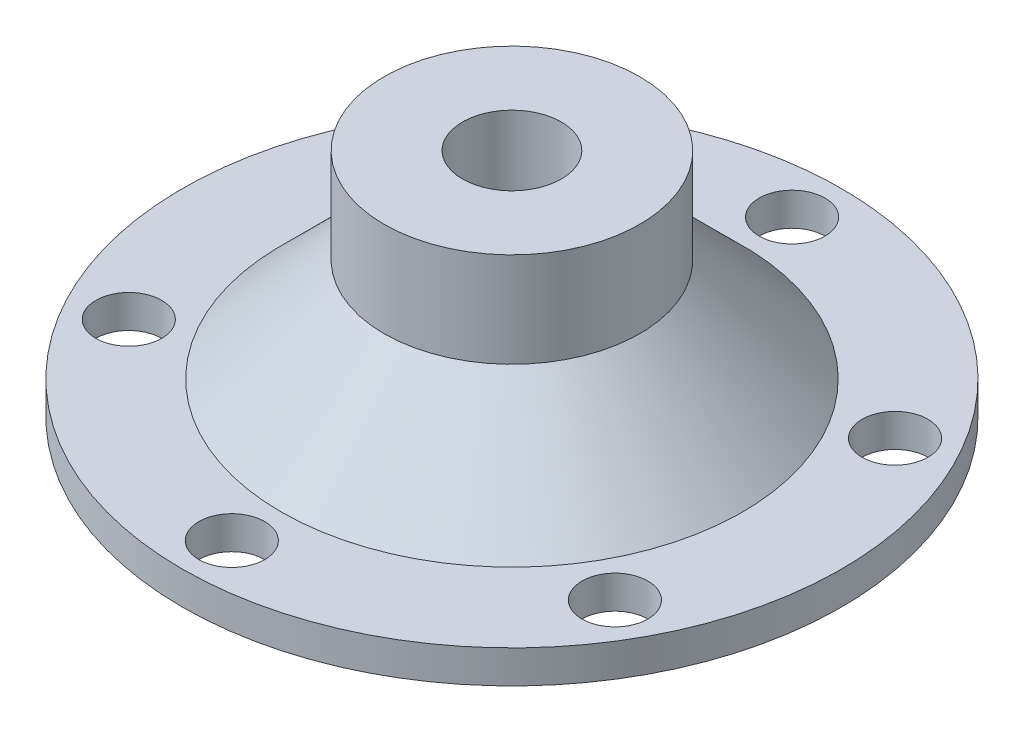
ISO-10303-21;
HEADER;
FILE_DESCRIPTION(('STEP AP214'),'2;1');
FILE_NAME('part.step','',(''),(''),'','','');
FILE_SCHEMA(('AUTOMOTIVE_DESIGN { 1 0 10303 214 1 1 1 1 }'));
ENDSEC;
DATA;
#1=APPLICATION_CONTEXT('core data for automotive mechanical design processes');
#2=APPLICATION_PROTOCOL_DEFINITION('international standard','automotive_design',2000,#1);
#3=PRODUCT_CONTEXT('',#1,'mechanical');
#4=PRODUCT('Part','Part','',(#3));
#5=PRODUCT_RELATED_PRODUCT_CATEGORY('part','',(#4));
#6=PRODUCT_DEFINITION_FORMATION('','',#4);
#7=PRODUCT_DEFINITION_CONTEXT('part definition',#1,'design');
#8=PRODUCT_DEFINITION('design','',#6,#7);
#9=PRODUCT_DEFINITION_SHAPE('','',#8);
#10=(LENGTH_UNIT() NAMED_UNIT(*) SI_UNIT(.MILLI.,.METRE.));
#11=(NAMED_UNIT(*) PLANE_ANGLE_UNIT() SI_UNIT($,.RADIAN.));
#12=(NAMED_UNIT(*) SI_UNIT($,.STERADIAN.) SOLID_ANGLE_UNIT());
#13=UNCERTAINTY_MEASURE_WITH_UNIT(LENGTH_MEASURE(1.E-05),#10,'distance_accuracy_value','');
#14=(GEOMETRIC_REPRESENTATION_CONTEXT(3) GLOBAL_UNCERTAINTY_ASSIGNED_CONTEXT((#13)) GLOBAL_UNIT_ASSIGNED_CONTEXT((#10,
#11,#12)) REPRESENTATION_CONTEXT('',''));
#15=CARTESIAN_POINT('',(0.,0.,0.));
#16=DIRECTION('',(0.,0.,1.));
#17=DIRECTION('',(1.,0.,0.));
#18=AXIS2_PLACEMENT_3D('',#15,#16,#17);
#19=CARTESIAN_POINT('',(0.,12.7,0.));
#20=DIRECTION('',(0.,-1.,0.));
#21=DIRECTION('',(0.,0.,-1.));
#22=AXIS2_PLACEMENT_3D('',#19,#20,#21);
#23=CYLINDRICAL_SURFACE('',#22,127.);
#24=CARTESIAN_POINT('',(0.,12.7,0.));
#25=DIRECTION('',(0.,1.,0.));
#26=DIRECTION('',(0.,0.,1.));
#27=AXIS2_PLACEMENT_3D('',#24,#25,#26);
#28=CIRCLE('',#27,127.);
#29=CARTESIAN_POINT('',(0.,12.7,127.));
#30=VERTEX_POINT('',#29);
#31=EDGE_CURVE('E38',#30,#30,#28,.T.);
#32=ORIENTED_EDGE('',*,*,#31,.F.);
#33=EDGE_LOOP('',(#32));
#34=FACE_BOUND('',#33,.T.);
#35=CARTESIAN_POINT('',(0.,0.,0.));
#36=DIRECTION('',(0.,1.,0.));
#37=DIRECTION('',(0.,0.,1.));
#38=AXIS2_PLACEMENT_3D('',#35,#36,#37);
#39=CIRCLE('',#38,127.);
#40=CARTESIAN_POINT('',(0.,0.,127.));
#41=VERTEX_POINT('',#40);
#42=EDGE_CURVE('E42',#41,#41,#39,.T.);
#43=ORIENTED_EDGE('',*,*,#42,.T.);
#44=EDGE_LOOP('',(#43));
#45=FACE_BOUND('',#44,.T.);
#46=ADVANCED_FACE('F31',(#34,#45),#23,.T.);
#47=CARTESIAN_POINT('',(0.,12.7,0.));
#48=DIRECTION('',(0.,1.,0.));
#49=DIRECTION('',(0.,0.,1.));
#50=AXIS2_PLACEMENT_3D('',#47,#48,#49);
#51=PLANE('',#50);
#52=CARTESIAN_POINT('',(0.,12.7,0.));
#53=DIRECTION('',(0.,1.,0.));
#54=DIRECTION('',(0.,0.,1.));
#55=AXIS2_PLACEMENT_3D('',#52,#53,#54);
#56=CIRCLE('',#55,88.9);
#57=CARTESIAN_POINT('',(0.,12.7,88.9));
#58=VERTEX_POINT('',#57);
#59=EDGE_CURVE('E78',#58,#58,#56,.T.);
#60=ORIENTED_EDGE('',*,*,#59,.F.);
#61=EDGE_LOOP('',(#60));
#62=FACE_BOUND('',#61,.T.);
#63=CARTESIAN_POINT('',(0.,12.7,-107.95));
#64=DIRECTION('',(0.,1.,0.));
#65=DIRECTION('',(0.,0.,1.));
#66=AXIS2_PLACEMENT_3D('',#63,#64,#65);
#67=CIRCLE('',#66,12.7);
#68=CARTESIAN_POINT('',(0.,12.7,-95.25));
#69=VERTEX_POINT('',#68);
#70=EDGE_CURVE('E74',#69,#69,#67,.T.);
#71=ORIENTED_EDGE('',*,*,#70,.F.);
#72=EDGE_LOOP('',(#71));
#73=FACE_BOUND('',#72,.T.);
#74=CARTESIAN_POINT('',(93.6625,12.7,53.975));
#75=DIRECTION('',(0.,1.,0.));
#76=DIRECTION('',(0.,0.,1.));
#77=AXIS2_PLACEMENT_3D('',#74,#75,#76);
#78=CIRCLE('',#77,12.7);
#79=CARTESIAN_POINT('',(93.6625,12.7,66.675));
#80=VERTEX_POINT('',#79);
#81=EDGE_CURVE('E75',#80,#80,#78,.T.);
#82=ORIENTED_EDGE('',*,*,#81,.F.);
#83=EDGE_LOOP('',(#82));
#84=FACE_BOUND('',#83,.T.);
#85=CARTESIAN_POINT('',(93.6625,12.7,-53.975));
#86=DIRECTION('',(0.,1.,0.));
#87=DIRECTION('',(0.,0.,1.));
#88=AXIS2_PLACEMENT_3D('',#85,#86,#87);
#89=CIRCLE('',#88,12.7);
#90=CARTESIAN_POINT('',(93.6625,12.7,-41.275));
#91=VERTEX_POINT('',#90);
#92=EDGE_CURVE('E49',#91,#91,#89,.T.);
#93=ORIENTED_EDGE('',*,*,#92,.F.);
#94=EDGE_LOOP('',(#93));
#95=FACE_BOUND('',#94,.T.);
#96=CARTESIAN_POINT('',(-93.6625,12.7,-53.975));
#97=DIRECTION('',(0.,1.,0.));
#98=DIRECTION('',(0.,0.,1.));
#99=AXIS2_PLACEMENT_3D('',#96,#97,#98);
#100=CIRCLE('',#99,12.7);
#101=CARTESIAN_POINT('',(-93.6625,12.7,-41.275));
#102=VERTEX_POINT('',#101);
#103=EDGE_CURVE('E56',#102,#102,#100,.T.);
#104=ORIENTED_EDGE('',*,*,#103,.F.);
#105=EDGE_LOOP('',(#104));
#106=FACE_BOUND('',#105,.T.);
#107=CARTESIAN_POINT('',(-93.6625,12.7,53.975));
#108=DIRECTION('',(0.,1.,0.));
#109=DIRECTION('',(0.,0.,1.));
#110=AXIS2_PLACEMENT_3D('',#107,#108,#109);
#111=CIRCLE('',#110,12.7);
#112=CARTESIAN_POINT('',(-93.6625,12.7,66.675));
#113=VERTEX_POINT('',#112);
#114=EDGE_CURVE('E62',#113,#113,#111,.T.);
#115=ORIENTED_EDGE('',*,*,#114,.F.);
#116=EDGE_LOOP('',(#115));
#117=FACE_BOUND('',#116,.T.);
#118=CARTESIAN_POINT('',(0.,12.7,107.95));
#119=DIRECTION('',(0.,1.,0.));
#120=DIRECTION('',(0.,0.,1.));
#121=AXIS2_PLACEMENT_3D('',#118,#119,#120);
#122=CIRCLE('',#121,12.7);
#123=CARTESIAN_POINT('',(0.,12.7,120.65));
#124=VERTEX_POINT('',#123);
#125=EDGE_CURVE('E68',#124,#124,#122,.T.);
#126=ORIENTED_EDGE('',*,*,#125,.F.);
#127=EDGE_LOOP('',(#126));
#128=FACE_BOUND('',#127,.T.);
#129=ORIENTED_EDGE('',*,*,#31,.T.);
#130=EDGE_LOOP('',(#129));
#131=FACE_BOUND('',#130,.T.);
#132=ADVANCED_FACE('F116',(#62,#73,#84,#95,#106,#117,#128,#131),#51,.T.);
#133=CARTESIAN_POINT('',(0.,0.,0.));
#134=DIRECTION('',(0.,1.,0.));
#135=DIRECTION('',(0.,0.,1.));
#136=AXIS2_PLACEMENT_3D('',#133,#134,#135);
#137=PLANE('',#136);
#138=CARTESIAN_POINT('',(0.,0.,0.));
#139=DIRECTION('',(0.,1.,0.));
#140=DIRECTION('',(0.,0.,1.));
#141=AXIS2_PLACEMENT_3D('',#138,#139,#140);
#142=CIRCLE('',#141,19.05);
#143=CARTESIAN_POINT('',(0.,0.,19.05));
#144=VERTEX_POINT('',#143);
#145=EDGE_CURVE('E87',#144,#144,#142,.T.);
#146=ORIENTED_EDGE('',*,*,#145,.T.);
#147=EDGE_LOOP('',(#146));
#148=FACE_BOUND('',#147,.T.);
#149=CARTESIAN_POINT('',(0.,0.,-107.95));
#150=DIRECTION('',(0.,1.,0.));
#151=DIRECTION('',(0.,0.,1.));
#152=AXIS2_PLACEMENT_3D('',#149,#150,#151);
#153=CIRCLE('',#152,12.7);
#154=CARTESIAN_POINT('',(0.,0.,-95.25));
#155=VERTEX_POINT('',#154);
#156=EDGE_CURVE('E47',#155,#155,#153,.T.);
#157=ORIENTED_EDGE('',*,*,#156,.T.);
#158=EDGE_LOOP('',(#157));
#159=FACE_BOUND('',#158,.T.);
#160=CARTESIAN_POINT('',(93.6625,0.,53.975));
#161=DIRECTION('',(0.,1.,0.));
#162=DIRECTION('',(0.,0.,1.));
#163=AXIS2_PLACEMENT_3D('',#160,#161,#162);
#164=CIRCLE('',#163,12.7);
#165=CARTESIAN_POINT('',(93.6625,0.,66.675));
#166=VERTEX_POINT('',#165);
#167=EDGE_CURVE('E53',#166,#166,#164,.T.);
#168=ORIENTED_EDGE('',*,*,#167,.T.);
#169=EDGE_LOOP('',(#168));
#170=FACE_BOUND('',#169,.T.);
#171=CARTESIAN_POINT('',(93.6625,0.,-53.975));
#172=DIRECTION('',(0.,1.,0.));
#173=DIRECTION('',(0.,0.,1.));
#174=AXIS2_PLACEMENT_3D('',#171,#172,#173);
#175=CIRCLE('',#174,12.7);
#176=CARTESIAN_POINT('',(93.6625,0.,-41.275));
#177=VERTEX_POINT('',#176);
#178=EDGE_CURVE('E52',#177,#177,#175,.T.);
#179=ORIENTED_EDGE('',*,*,#178,.T.);
#180=EDGE_LOOP('',(#179));
#181=FACE_BOUND('',#180,.T.);
#182=CARTESIAN_POINT('',(-93.6625,0.,-53.975));
#183=DIRECTION('',(0.,1.,0.));
#184=DIRECTION('',(0.,0.,1.));
#185=AXIS2_PLACEMENT_3D('',#182,#183,#184);
#186=CIRCLE('',#185,12.7);
#187=CARTESIAN_POINT('',(-93.6625,0.,-41.275));
#188=VERTEX_POINT('',#187);
#189=EDGE_CURVE('E59',#188,#188,#186,.T.);
#190=ORIENTED_EDGE('',*,*,#189,.T.);
#191=EDGE_LOOP('',(#190));
#192=FACE_BOUND('',#191,.T.);
#193=CARTESIAN_POINT('',(-93.6625,0.,53.975));
#194=DIRECTION('',(0.,1.,0.));
#195=DIRECTION('',(0.,0.,1.));
#196=AXIS2_PLACEMENT_3D('',#193,#194,#195);
#197=CIRCLE('',#196,12.7);
#198=CARTESIAN_POINT('',(-93.6625,0.,66.675));
#199=VERTEX_POINT('',#198);
#200=EDGE_CURVE('E65',#199,#199,#197,.T.);
#201=ORIENTED_EDGE('',*,*,#200,.T.);
#202=EDGE_LOOP('',(#201));
#203=FACE_BOUND('',#202,.T.);
#204=CARTESIAN_POINT('',(0.,0.,107.95));
#205=DIRECTION('',(0.,1.,0.));
#206=DIRECTION('',(0.,0.,1.));
#207=AXIS2_PLACEMENT_3D('',#204,#205,#206);
#208=CIRCLE('',#207,12.7);
#209=CARTESIAN_POINT('',(0.,0.,120.65));
#210=VERTEX_POINT('',#209);
#211=EDGE_CURVE('E71',#210,#210,#208,.T.);
#212=ORIENTED_EDGE('',*,*,#211,.T.);
#213=EDGE_LOOP('',(#212));
#214=FACE_BOUND('',#213,.T.);
#215=ORIENTED_EDGE('',*,*,#42,.F.);
#216=EDGE_LOOP('',(#215));
#217=FACE_BOUND('',#216,.T.);
#218=ADVANCED_FACE('F121',(#148,#159,#170,#181,#192,#203,#214,#217),#137,.F.);
#219=CARTESIAN_POINT('',(0.,0.,107.95));
#220=DIRECTION('',(0.,1.,0.));
#221=DIRECTION('',(0.,0.,1.));
#222=AXIS2_PLACEMENT_3D('',#219,#220,#221);
#223=CYLINDRICAL_SURFACE('',#222,12.7);
#224=ORIENTED_EDGE('',*,*,#211,.F.);
#225=EDGE_LOOP('',(#224));
#226=FACE_BOUND('',#225,.T.);
#227=ORIENTED_EDGE('',*,*,#125,.T.);
#228=EDGE_LOOP('',(#227));
#229=FACE_BOUND('',#228,.T.);
#230=ADVANCED_FACE('F127',(#226,#229),#223,.F.);
#231=CARTESIAN_POINT('',(-93.6625,0.,53.975));
#232=DIRECTION('',(0.,1.,0.));
#233=DIRECTION('',(0.,0.,1.));
#234=AXIS2_PLACEMENT_3D('',#231,#232,#233);
#235=CYLINDRICAL_SURFACE('',#234,12.7);
#236=ORIENTED_EDGE('',*,*,#200,.F.);
#237=EDGE_LOOP('',(#236));
#238=FACE_BOUND('',#237,.T.);
#239=ORIENTED_EDGE('',*,*,#114,.T.);
#240=EDGE_LOOP('',(#239));
#241=FACE_BOUND('',#240,.T.);
#242=ADVANCED_FACE('F138',(#238,#241),#235,.F.);
#243=CARTESIAN_POINT('',(-93.6625,0.,-53.975));
#244=DIRECTION('',(0.,1.,0.));
#245=DIRECTION('',(0.,0.,1.));
#246=AXIS2_PLACEMENT_3D('',#243,#244,#245);
#247=CYLINDRICAL_SURFACE('',#246,12.7);
#248=ORIENTED_EDGE('',*,*,#189,.F.);
#249=EDGE_LOOP('',(#248));
#250=FACE_BOUND('',#249,.T.);
#251=ORIENTED_EDGE('',*,*,#103,.T.);
#252=EDGE_LOOP('',(#251));
#253=FACE_BOUND('',#252,.T.);
#254=ADVANCED_FACE('F134',(#250,#253),#247,.F.);
#255=CARTESIAN_POINT('',(93.6625,0.,-53.975));
#256=DIRECTION('',(0.,1.,0.));
#257=DIRECTION('',(0.,0.,1.));
#258=AXIS2_PLACEMENT_3D('',#255,#256,#257);
#259=CYLINDRICAL_SURFACE('',#258,12.7);
#260=ORIENTED_EDGE('',*,*,#178,.F.);
#261=EDGE_LOOP('',(#260));
#262=FACE_BOUND('',#261,.T.);
#263=ORIENTED_EDGE('',*,*,#92,.T.);
#264=EDGE_LOOP('',(#263));
#265=FACE_BOUND('',#264,.T.);
#266=ADVANCED_FACE('F130',(#262,#265),#259,.F.);
#267=CARTESIAN_POINT('',(93.6625,0.,53.975));
#268=DIRECTION('',(0.,1.,0.));
#269=DIRECTION('',(0.,0.,1.));
#270=AXIS2_PLACEMENT_3D('',#267,#268,#269);
#271=CYLINDRICAL_SURFACE('',#270,12.7);
#272=ORIENTED_EDGE('',*,*,#167,.F.);
#273=EDGE_LOOP('',(#272));
#274=FACE_BOUND('',#273,.T.);
#275=ORIENTED_EDGE('',*,*,#81,.T.);
#276=EDGE_LOOP('',(#275));
#277=FACE_BOUND('',#276,.T.);
#278=ADVANCED_FACE('F133',(#274,#277),#271,.F.);
#279=CARTESIAN_POINT('',(0.,0.,-107.95));
#280=DIRECTION('',(0.,1.,0.));
#281=DIRECTION('',(0.,0.,1.));
#282=AXIS2_PLACEMENT_3D('',#279,#280,#281);
#283=CYLINDRICAL_SURFACE('',#282,12.7);
#284=ORIENTED_EDGE('',*,*,#156,.F.);
#285=EDGE_LOOP('',(#284));
#286=FACE_BOUND('',#285,.T.);
#287=ORIENTED_EDGE('',*,*,#70,.T.);
#288=EDGE_LOOP('',(#287));
#289=FACE_BOUND('',#288,.T.);
#290=ADVANCED_FACE('F148',(#286,#289),#283,.F.);
#291=CARTESIAN_POINT('',(0.,52.3875,0.));
#292=DIRECTION('',(0.,-1.,0.));
#293=DIRECTION('',(0.,0.,-1.));
#294=AXIS2_PLACEMENT_3D('',#291,#292,#293);
#295=CONICAL_SURFACE('',#294,49.2125000000001,0.785398163397448);
#296=ORIENTED_EDGE('',*,*,#59,.T.);
#297=EDGE_LOOP('',(#296));
#298=FACE_BOUND('',#297,.T.);
#299=CARTESIAN_POINT('',(0.,52.3875,0.));
#300=DIRECTION('',(0.,1.,0.));
#301=DIRECTION('',(0.,0.,1.));
#302=AXIS2_PLACEMENT_3D('',#299,#300,#301);
#303=CIRCLE('',#302,49.2125000000001);
#304=CARTESIAN_POINT('',(0.,52.3875,49.2125000000001));
#305=VERTEX_POINT('',#304);
#306=EDGE_CURVE('E10',#305,#305,#303,.T.);
#307=ORIENTED_EDGE('',*,*,#306,.F.);
#308=EDGE_LOOP('',(#307));
#309=FACE_BOUND('',#308,.T.);
#310=ADVANCED_FACE('F33',(#298,#309),#295,.T.);
#311=CARTESIAN_POINT('',(0.,-36.068,0.));
#312=DIRECTION('',(0.,1.,0.));
#313=DIRECTION('',(0.,0.,1.));
#314=AXIS2_PLACEMENT_3D('',#311,#312,#313);
#315=CYLINDRICAL_SURFACE('',#314,19.05);
#316=ORIENTED_EDGE('',*,*,#145,.F.);
#317=EDGE_LOOP('',(#316));
#318=FACE_BOUND('',#317,.T.);
#319=CARTESIAN_POINT('',(0.,88.9,0.));
#320=DIRECTION('',(0.,1.,0.));
#321=DIRECTION('',(0.,0.,1.));
#322=AXIS2_PLACEMENT_3D('',#319,#320,#321);
#323=CIRCLE('',#322,19.05);
#324=CARTESIAN_POINT('',(0.,88.9,19.05));
#325=VERTEX_POINT('',#324);
#326=EDGE_CURVE('E94',#325,#325,#323,.T.);
#327=ORIENTED_EDGE('',*,*,#326,.T.);
#328=EDGE_LOOP('',(#327));
#329=FACE_BOUND('',#328,.T.);
#330=ADVANCED_FACE('F100',(#318,#329),#315,.F.);
#331=CARTESIAN_POINT('',(0.,88.9,0.));
#332=DIRECTION('',(0.,1.,0.));
#333=DIRECTION('',(0.,0.,1.));
#334=AXIS2_PLACEMENT_3D('',#331,#332,#333);
#335=PLANE('',#334);
#336=CARTESIAN_POINT('',(0.,88.9,0.));
#337=DIRECTION('',(0.,1.,0.));
#338=DIRECTION('',(0.,0.,1.));
#339=AXIS2_PLACEMENT_3D('',#336,#337,#338);
#340=CIRCLE('',#339,49.276);
#341=CARTESIAN_POINT('',(0.,88.9,49.276));
#342=VERTEX_POINT('',#341);
#343=EDGE_CURVE('E90',#342,#342,#340,.T.);
#344=ORIENTED_EDGE('',*,*,#343,.T.);
#345=EDGE_LOOP('',(#344));
#346=FACE_BOUND('',#345,.T.);
#347=ORIENTED_EDGE('',*,*,#326,.F.);
#348=EDGE_LOOP('',(#347));
#349=FACE_BOUND('',#348,.T.);
#350=ADVANCED_FACE('F102',(#346,#349),#335,.T.);
#351=CARTESIAN_POINT('',(0.,52.3875,0.));
#352=DIRECTION('',(0.,1.,0.));
#353=DIRECTION('',(0.,0.,1.));
#354=AXIS2_PLACEMENT_3D('',#351,#352,#353);
#355=PLANE('',#354);
#356=ORIENTED_EDGE('',*,*,#306,.T.);
#357=EDGE_LOOP('',(#356));
#358=FACE_BOUND('',#357,.T.);
#359=CARTESIAN_POINT('',(0.,52.3875,0.));
#360=DIRECTION('',(0.,1.,0.));
#361=DIRECTION('',(0.,0.,1.));
#362=AXIS2_PLACEMENT_3D('',#359,#360,#361);
#363=CIRCLE('',#362,49.276);
#364=CARTESIAN_POINT('',(0.,52.3875,49.276));
#365=VERTEX_POINT('',#364);
#366=EDGE_CURVE('E91',#365,#365,#363,.T.);
#367=ORIENTED_EDGE('',*,*,#366,.F.);
#368=EDGE_LOOP('',(#367));
#369=FACE_BOUND('',#368,.T.);
#370=ADVANCED_FACE('F104',(#358,#369),#355,.F.);
#371=CARTESIAN_POINT('',(0.,88.9,0.));
#372=DIRECTION('',(0.,-1.,0.));
#373=DIRECTION('',(0.,0.,-1.));
#374=AXIS2_PLACEMENT_3D('',#371,#372,#373);
#375=CYLINDRICAL_SURFACE('',#374,49.276);
#376=ORIENTED_EDGE('',*,*,#343,.F.);
#377=EDGE_LOOP('',(#376));
#378=FACE_BOUND('',#377,.T.);
#379=ORIENTED_EDGE('',*,*,#366,.T.);
#380=EDGE_LOOP('',(#379));
#381=FACE_BOUND('',#380,.T.);
#382=ADVANCED_FACE('F111',(#378,#381),#375,.T.);
#383=CLOSED_SHELL('',(#46,#132,#218,#230,#242,#254,#266,#278,#290,#310,#330,#350,#370,#382));
#384=MANIFOLD_SOLID_BREP('B2',#383);
#385=ADVANCED_BREP_SHAPE_REPRESENTATION('',(#18,#384),#14);
#386=SHAPE_DEFINITION_REPRESENTATION(#9,#385);
ENDSEC;
END-ISO-10303-21;
